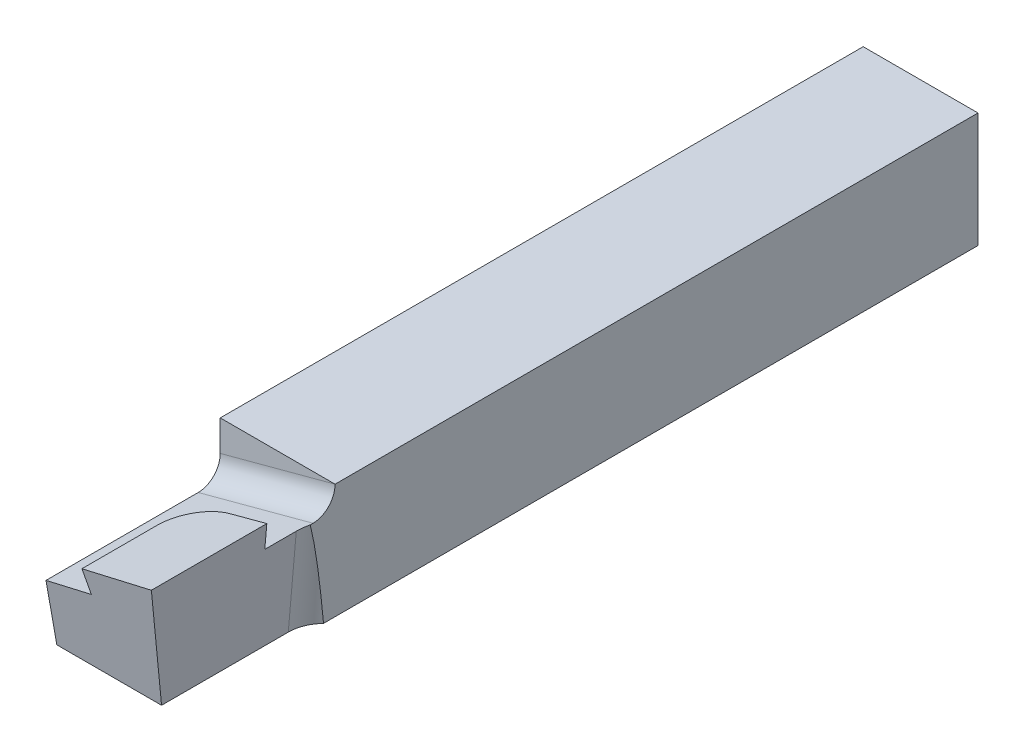
ISO-10303-21;
HEADER;
FILE_DESCRIPTION(('STEP AP214'),'2;1');
FILE_NAME('part.step','',(''),(''),'','','');
FILE_SCHEMA(('AUTOMOTIVE_DESIGN { 1 0 10303 214 1 1 1 1 }'));
ENDSEC;
DATA;
#1=APPLICATION_CONTEXT('core data for automotive mechanical design processes');
#2=APPLICATION_PROTOCOL_DEFINITION('international standard','automotive_design',2000,#1);
#3=PRODUCT_CONTEXT('',#1,'mechanical');
#4=PRODUCT('Part','Part','',(#3));
#5=PRODUCT_RELATED_PRODUCT_CATEGORY('part','',(#4));
#6=PRODUCT_DEFINITION_FORMATION('','',#4);
#7=PRODUCT_DEFINITION_CONTEXT('part definition',#1,'design');
#8=PRODUCT_DEFINITION('design','',#6,#7);
#9=PRODUCT_DEFINITION_SHAPE('','',#8);
#10=(LENGTH_UNIT() NAMED_UNIT(*) SI_UNIT(.MILLI.,.METRE.));
#11=(NAMED_UNIT(*) PLANE_ANGLE_UNIT() SI_UNIT($,.RADIAN.));
#12=(NAMED_UNIT(*) SI_UNIT($,.STERADIAN.) SOLID_ANGLE_UNIT());
#13=UNCERTAINTY_MEASURE_WITH_UNIT(LENGTH_MEASURE(1.E-05),#10,'distance_accuracy_value','');
#14=(GEOMETRIC_REPRESENTATION_CONTEXT(3) GLOBAL_UNCERTAINTY_ASSIGNED_CONTEXT((#13)) GLOBAL_UNIT_ASSIGNED_CONTEXT((#10,
#11,#12)) REPRESENTATION_CONTEXT('',''));
#15=CARTESIAN_POINT('',(0.,0.,0.));
#16=DIRECTION('',(0.,0.,1.));
#17=DIRECTION('',(1.,0.,0.));
#18=AXIS2_PLACEMENT_3D('',#15,#16,#17);
#19=CARTESIAN_POINT('',(3.96875,-3.96875,57.15));
#20=DIRECTION('',(-1.,0.,0.));
#21=DIRECTION('',(0.,0.,1.));
#22=AXIS2_PLACEMENT_3D('',#19,#20,#21);
#23=PLANE('',#22);
#24=DIRECTION('',(0.,0.,-1.));
#25=VECTOR('',#24,1.);
#26=CARTESIAN_POINT('',(3.96875,3.96875,57.15));
#27=LINE('',#26,#25);
#28=CARTESIAN_POINT('',(3.96875,3.96875,44.45));
#29=VERTEX_POINT('',#28);
#30=CARTESIAN_POINT('',(3.96875,3.96875,0.));
#31=VERTEX_POINT('',#30);
#32=EDGE_CURVE('E202',#29,#31,#27,.T.);
#33=ORIENTED_EDGE('',*,*,#32,.F.);
#34=CARTESIAN_POINT('',(3.96875,3.96875,45.974));
#35=DIRECTION('',(-1.,0.,0.));
#36=DIRECTION('',(0.,-1.,0.));
#37=AXIS2_PLACEMENT_3D('',#34,#35,#36);
#38=ELLIPSE('',#37,1.57776089894496,1.524);
#39=CARTESIAN_POINT('',(3.96875,2.39098910105504,45.974));
#40=VERTEX_POINT('',#39);
#41=EDGE_CURVE('E45',#29,#40,#38,.T.);
#42=ORIENTED_EDGE('',*,*,#41,.T.);
#43=DIRECTION('',(0.,0.,-1.));
#44=VECTOR('',#43,1.);
#45=CARTESIAN_POINT('',(3.96875,2.39098910105504,57.15));
#46=LINE('',#45,#44);
#47=CARTESIAN_POINT('',(3.96875,2.39098910105504,46.1655934043086));
#48=VERTEX_POINT('',#47);
#49=EDGE_CURVE('E164',#48,#40,#46,.T.);
#50=ORIENTED_EDGE('',*,*,#49,.F.);
#51=CARTESIAN_POINT('',(3.96875,-25.1744816440037,46.99));
#52=DIRECTION('',(-1.,0.,0.));
#53=DIRECTION('',(0.,-1.,0.));
#54=AXIS2_PLACEMENT_3D('',#51,#52,#53);
#55=ELLIPSE('',#54,29.1432316440037,2.54);
#56=CARTESIAN_POINT('',(3.96875,-3.96875,45.2476590504527));
#57=VERTEX_POINT('',#56);
#58=EDGE_CURVE('E207',#48,#57,#55,.T.);
#59=ORIENTED_EDGE('',*,*,#58,.T.);
#60=DIRECTION('',(0.,0.,-1.));
#61=VECTOR('',#60,1.);
#62=CARTESIAN_POINT('',(3.96875,-3.96875,57.15));
#63=LINE('',#62,#61);
#64=CARTESIAN_POINT('',(3.96875,-3.96875,0.));
#65=VERTEX_POINT('',#64);
#66=EDGE_CURVE('E196',#57,#65,#63,.T.);
#67=ORIENTED_EDGE('',*,*,#66,.T.);
#68=DIRECTION('',(0.,1.,0.));
#69=VECTOR('',#68,1.);
#70=CARTESIAN_POINT('',(3.96875,-3.96875,0.));
#71=LINE('',#70,#69);
#72=EDGE_CURVE('E184',#65,#31,#71,.T.);
#73=ORIENTED_EDGE('',*,*,#72,.T.);
#74=EDGE_LOOP('',(#33,#42,#50,#59,#67,#73));
#75=FACE_BOUND('',#74,.T.);
#76=ADVANCED_FACE('F37',(#75),#23,.F.);
#77=CARTESIAN_POINT('',(-3.96875,-3.96875,57.15));
#78=DIRECTION('',(1.,0.,0.));
#79=DIRECTION('',(0.,0.,-1.));
#80=AXIS2_PLACEMENT_3D('',#77,#78,#79);
#81=PLANE('',#80);
#82=DIRECTION('',(0.,0.,1.));
#83=VECTOR('',#82,1.);
#84=CARTESIAN_POINT('',(-3.96875,0.264142386133057,57.15));
#85=LINE('',#84,#83);
#86=CARTESIAN_POINT('',(-3.96875,0.264142386133057,45.974));
#87=VERTEX_POINT('',#86);
#88=CARTESIAN_POINT('',(-3.96875,0.264142386133057,56.4967777247373));
#89=VERTEX_POINT('',#88);
#90=EDGE_CURVE('E153',#87,#89,#85,.T.);
#91=ORIENTED_EDGE('',*,*,#90,.F.);
#92=CARTESIAN_POINT('',(-3.96875,1.84190328507802,45.974));
#93=DIRECTION('',(1.,0.,0.));
#94=DIRECTION('',(0.,-1.,0.));
#95=AXIS2_PLACEMENT_3D('',#92,#93,#94);
#96=ELLIPSE('',#95,1.57776089894496,1.524);
#97=CARTESIAN_POINT('',(-3.96875,1.84190328507802,44.45));
#98=VERTEX_POINT('',#97);
#99=EDGE_CURVE('E12',#87,#98,#96,.T.);
#100=ORIENTED_EDGE('',*,*,#99,.T.);
#101=DIRECTION('',(0.,-1.,0.));
#102=VECTOR('',#101,1.);
#103=CARTESIAN_POINT('',(-3.96875,-3.96875,44.45));
#104=LINE('',#103,#102);
#105=CARTESIAN_POINT('',(-3.96875,3.96875,44.45));
#106=VERTEX_POINT('',#105);
#107=EDGE_CURVE('E181',#106,#98,#104,.T.);
#108=ORIENTED_EDGE('',*,*,#107,.F.);
#109=DIRECTION('',(0.,0.,-1.));
#110=VECTOR('',#109,1.);
#111=CARTESIAN_POINT('',(-3.96875,3.96875,57.15));
#112=LINE('',#111,#110);
#113=CARTESIAN_POINT('',(-3.96875,3.96875,0.));
#114=VERTEX_POINT('',#113);
#115=EDGE_CURVE('E200',#106,#114,#112,.T.);
#116=ORIENTED_EDGE('',*,*,#115,.T.);
#117=DIRECTION('',(0.,-1.,0.));
#118=VECTOR('',#117,1.);
#119=CARTESIAN_POINT('',(-3.96875,-3.96875,0.));
#120=LINE('',#119,#118);
#121=CARTESIAN_POINT('',(-3.96875,-3.96875,0.));
#122=VERTEX_POINT('',#121);
#123=EDGE_CURVE('E190',#114,#122,#120,.T.);
#124=ORIENTED_EDGE('',*,*,#123,.T.);
#125=DIRECTION('',(0.,0.,-1.));
#126=VECTOR('',#125,1.);
#127=CARTESIAN_POINT('',(-3.96875,-3.96875,57.15));
#128=LINE('',#127,#126);
#129=CARTESIAN_POINT('',(-3.96875,-3.96875,55.7504045906266));
#130=VERTEX_POINT('',#129);
#131=EDGE_CURVE('E198',#130,#122,#128,.T.);
#132=ORIENTED_EDGE('',*,*,#131,.F.);
#133=DIRECTION('',(0.,0.984807753012209,0.173648177666925));
#134=VECTOR('',#133,1.);
#135=CARTESIAN_POINT('',(-3.96875,3.96875,57.15));
#136=LINE('',#135,#134);
#137=EDGE_CURVE('E166',#130,#89,#136,.T.);
#138=ORIENTED_EDGE('',*,*,#137,.T.);
#139=EDGE_LOOP('',(#91,#100,#108,#116,#124,#132,#138));
#140=FACE_BOUND('',#139,.T.);
#141=ADVANCED_FACE('F242',(#140),#81,.F.);
#142=CARTESIAN_POINT('',(-3.96875,1.84190328507802,44.45));
#143=DIRECTION('',(-0.258819045102515,0.96592582628907,0.));
#144=DIRECTION('',(-0.96592582628907,-0.258819045102515,0.));
#145=AXIS2_PLACEMENT_3D('',#142,#143,#144);
#146=PLANE('',#145);
#147=DIRECTION('',(0.,0.,1.));
#148=VECTOR('',#147,1.);
#149=CARTESIAN_POINT('',(3.96875,3.96875,44.45));
#150=LINE('',#149,#148);
#151=CARTESIAN_POINT('',(3.96875,3.96875,49.1667074892632));
#152=VERTEX_POINT('',#151);
#153=CARTESIAN_POINT('',(3.96875,3.96875,57.15));
#154=VERTEX_POINT('',#153);
#155=EDGE_CURVE('E175',#152,#154,#150,.T.);
#156=ORIENTED_EDGE('',*,*,#155,.F.);
#157=DIRECTION('',(-0.96592582628907,-0.258819045102515,0.));
#158=VECTOR('',#157,1.);
#159=CARTESIAN_POINT('',(-0.726331660634737,2.71070666063478,49.1667074892632));
#160=LINE('',#159,#158);
#161=CARTESIAN_POINT('',(1.38207648375664,3.27565292023964,49.1667074892632));
#162=VERTEX_POINT('',#161);
#163=EDGE_CURVE('E137',#152,#162,#160,.T.);
#164=ORIENTED_EDGE('',*,*,#163,.T.);
#165=CARTESIAN_POINT('',(1.38207648375664,3.27565292023964,51.7067074892632));
#166=DIRECTION('',(-0.258819045102515,0.96592582628907,0.));
#167=DIRECTION('',(-0.96592582628907,-0.258819045102515,0.));
#168=AXIS2_PLACEMENT_3D('',#165,#166,#167);
#169=CIRCLE('',#168,2.54);
#170=CARTESIAN_POINT('',(-1.0713751150176,2.61825254567925,51.7067074892632));
#171=VERTEX_POINT('',#170);
#172=EDGE_CURVE('E282',#162,#171,#169,.T.);
#173=ORIENTED_EDGE('',*,*,#172,.T.);
#174=DIRECTION('',(0.,0.,-1.));
#175=VECTOR('',#174,1.);
#176=CARTESIAN_POINT('',(-1.0713751150176,2.61825254567925,0.));
#177=LINE('',#176,#175);
#178=CARTESIAN_POINT('',(-1.07137511501769,2.61825254567923,56.9118708614252));
#179=VERTEX_POINT('',#178);
#180=EDGE_CURVE('E150',#179,#171,#177,.T.);
#181=ORIENTED_EDGE('',*,*,#180,.F.);
#182=DIRECTION('',(-0.964921520309633,-0.258549942126371,-0.0455893306574897));
#183=VECTOR('',#182,1.);
#184=CARTESIAN_POINT('',(-4.51092740598211,1.69662728699072,56.749363462216));
#185=LINE('',#184,#183);
#186=EDGE_CURVE('E171',#154,#179,#185,.T.);
#187=ORIENTED_EDGE('',*,*,#186,.F.);
#188=EDGE_LOOP('',(#156,#164,#173,#181,#187));
#189=FACE_BOUND('',#188,.T.);
#190=ADVANCED_FACE('F254',(#189),#146,.T.);
#191=CARTESIAN_POINT('',(3.96875,3.96875,44.45));
#192=DIRECTION('',(0.996194698091746,-0.0871557427476514,0.));
#193=DIRECTION('',(0.0871557427476514,0.996194698091746,0.));
#194=AXIS2_PLACEMENT_3D('',#191,#192,#193);
#195=PLANE('',#194);
#196=DIRECTION('',(0.,0.,1.));
#197=VECTOR('',#196,1.);
#198=CARTESIAN_POINT('',(3.82740021283627,2.35311453973421,44.45));
#199=LINE('',#198,#197);
#200=CARTESIAN_POINT('',(3.82740021283627,2.35311453973421,46.99));
#201=VERTEX_POINT('',#200);
#202=CARTESIAN_POINT('',(3.82740021283627,2.35311453973421,49.1667074892632));
#203=VERTEX_POINT('',#202);
#204=EDGE_CURVE('E161',#201,#203,#199,.T.);
#205=ORIENTED_EDGE('',*,*,#204,.T.);
#206=DIRECTION('',(0.0871557427476514,0.996194698091746,0.));
#207=VECTOR('',#206,1.);
#208=CARTESIAN_POINT('',(3.96875,3.96875,49.1667074892632));
#209=LINE('',#208,#207);
#210=EDGE_CURVE('E217',#203,#152,#209,.T.);
#211=ORIENTED_EDGE('',*,*,#210,.T.);
#212=ORIENTED_EDGE('',*,*,#155,.T.);
#213=DIRECTION('',(0.0858414827856193,0.981172637986293,0.173007208809877));
#214=VECTOR('',#213,1.);
#215=CARTESIAN_POINT('',(3.78013981922212,1.81292576887537,56.7698700223877));
#216=LINE('',#215,#214);
#217=CARTESIAN_POINT('',(3.27430873326303,-3.96875,55.7504045906266));
#218=VERTEX_POINT('',#217);
#219=EDGE_CURVE('E211',#218,#154,#216,.T.);
#220=ORIENTED_EDGE('',*,*,#219,.F.);
#221=DIRECTION('',(0.,0.,1.));
#222=VECTOR('',#221,1.);
#223=CARTESIAN_POINT('',(3.27430873326303,-3.96875,44.45));
#224=LINE('',#223,#222);
#225=CARTESIAN_POINT('',(3.27430873326303,-3.96875,46.99));
#226=VERTEX_POINT('',#225);
#227=EDGE_CURVE('E174',#226,#218,#224,.T.);
#228=ORIENTED_EDGE('',*,*,#227,.F.);
#229=DIRECTION('',(0.0871557427476514,0.996194698091746,0.));
#230=VECTOR('',#229,1.);
#231=CARTESIAN_POINT('',(3.96875,3.96875,46.99));
#232=LINE('',#231,#230);
#233=EDGE_CURVE('E204',#226,#201,#232,.T.);
#234=ORIENTED_EDGE('',*,*,#233,.T.);
#235=EDGE_LOOP('',(#205,#211,#212,#220,#228,#234));
#236=FACE_BOUND('',#235,.T.);
#237=ADVANCED_FACE('F259',(#236),#195,.T.);
#238=CARTESIAN_POINT('',(6.49908453315304,3.74737441342097,46.99));
#239=DIRECTION('',(-0.0871557427476514,-0.996194698091746,0.));
#240=DIRECTION('',(0.996194698091746,-0.0871557427476514,0.));
#241=AXIS2_PLACEMENT_3D('',#238,#239,#240);
#242=CYLINDRICAL_SURFACE('',#241,2.54);
#243=CARTESIAN_POINT('',(6.43830887009729,3.05270540595871,46.99));
#244=DIRECTION('',(-0.258819045102515,0.96592582628907,0.));
#245=DIRECTION('',(-0.96592582628907,-0.258819045102515,0.));
#246=AXIS2_PLACEMENT_3D('',#243,#244,#245);
#247=ELLIPSE('',#246,2.7030115420888,2.54);
#248=EDGE_CURVE('E159',#201,#48,#247,.F.);
#249=ORIENTED_EDGE('',*,*,#248,.F.);
#250=ORIENTED_EDGE('',*,*,#233,.F.);
#251=CARTESIAN_POINT('',(5.82401112062313,-3.96875,46.99));
#252=DIRECTION('',(0.,1.,0.));
#253=DIRECTION('',(-1.,0.,0.));
#254=AXIS2_PLACEMENT_3D('',#251,#252,#253);
#255=ELLIPSE('',#254,2.5497023873601,2.54);
#256=EDGE_CURVE('E209',#57,#226,#255,.T.);
#257=ORIENTED_EDGE('',*,*,#256,.F.);
#258=ORIENTED_EDGE('',*,*,#58,.F.);
#259=EDGE_LOOP('',(#249,#250,#257,#258));
#260=FACE_BOUND('',#259,.T.);
#261=ADVANCED_FACE('F257',(#260),#242,.F.);
#262=CARTESIAN_POINT('',(-3.96875,3.96875,57.15));
#263=DIRECTION('',(0.,-1.,0.));
#264=DIRECTION('',(0.,0.,-1.));
#265=AXIS2_PLACEMENT_3D('',#262,#263,#264);
#266=PLANE('',#265);
#267=DIRECTION('',(-1.,0.,0.));
#268=VECTOR('',#267,1.);
#269=CARTESIAN_POINT('',(-3.96875,3.96875,44.45));
#270=LINE('',#269,#268);
#271=EDGE_CURVE('E177',#29,#106,#270,.T.);
#272=ORIENTED_EDGE('',*,*,#271,.F.);
#273=ORIENTED_EDGE('',*,*,#32,.T.);
#274=DIRECTION('',(-1.,0.,0.));
#275=VECTOR('',#274,1.);
#276=CARTESIAN_POINT('',(-3.96875,3.96875,0.));
#277=LINE('',#276,#275);
#278=EDGE_CURVE('E187',#31,#114,#277,.T.);
#279=ORIENTED_EDGE('',*,*,#278,.T.);
#280=ORIENTED_EDGE('',*,*,#115,.F.);
#281=EDGE_LOOP('',(#272,#273,#279,#280));
#282=FACE_BOUND('',#281,.T.);
#283=ADVANCED_FACE('F232',(#282),#266,.F.);
#284=CARTESIAN_POINT('',(-3.96875,-3.96875,57.15));
#285=DIRECTION('',(0.,1.,0.));
#286=DIRECTION('',(0.,0.,1.));
#287=AXIS2_PLACEMENT_3D('',#284,#285,#286);
#288=PLANE('',#287);
#289=ORIENTED_EDGE('',*,*,#227,.T.);
#290=DIRECTION('',(1.,0.,0.));
#291=VECTOR('',#290,1.);
#292=CARTESIAN_POINT('',(-3.96875,-3.96875,55.7504045906266));
#293=LINE('',#292,#291);
#294=EDGE_CURVE('E169',#130,#218,#293,.T.);
#295=ORIENTED_EDGE('',*,*,#294,.F.);
#296=ORIENTED_EDGE('',*,*,#131,.T.);
#297=DIRECTION('',(1.,0.,0.));
#298=VECTOR('',#297,1.);
#299=CARTESIAN_POINT('',(-3.96875,-3.96875,0.));
#300=LINE('',#299,#298);
#301=EDGE_CURVE('E193',#122,#65,#300,.T.);
#302=ORIENTED_EDGE('',*,*,#301,.T.);
#303=ORIENTED_EDGE('',*,*,#66,.F.);
#304=ORIENTED_EDGE('',*,*,#256,.T.);
#305=EDGE_LOOP('',(#289,#295,#296,#302,#303,#304));
#306=FACE_BOUND('',#305,.T.);
#307=ADVANCED_FACE('F265',(#306),#288,.F.);
#308=CARTESIAN_POINT('',(0.,0.,0.));
#309=DIRECTION('',(0.,0.,-1.));
#310=DIRECTION('',(-1.,0.,0.));
#311=AXIS2_PLACEMENT_3D('',#308,#309,#310);
#312=PLANE('',#311);
#313=ORIENTED_EDGE('',*,*,#72,.F.);
#314=ORIENTED_EDGE('',*,*,#301,.F.);
#315=ORIENTED_EDGE('',*,*,#123,.F.);
#316=ORIENTED_EDGE('',*,*,#278,.F.);
#317=EDGE_LOOP('',(#313,#314,#315,#316));
#318=FACE_BOUND('',#317,.T.);
#319=ADVANCED_FACE('F238',(#318),#312,.T.);
#320=CARTESIAN_POINT('',(0.,0.,44.45));
#321=DIRECTION('',(0.,0.,1.));
#322=DIRECTION('',(1.,0.,0.));
#323=AXIS2_PLACEMENT_3D('',#320,#321,#322);
#324=PLANE('',#323);
#325=ORIENTED_EDGE('',*,*,#107,.T.);
#326=DIRECTION('',(0.96592582628907,0.258819045102515,0.));
#327=VECTOR('',#326,1.);
#328=CARTESIAN_POINT('',(3.57430977526377,3.86306006031958,44.45));
#329=LINE('',#328,#327);
#330=EDGE_CURVE('E220',#98,#29,#329,.T.);
#331=ORIENTED_EDGE('',*,*,#330,.T.);
#332=ORIENTED_EDGE('',*,*,#271,.T.);
#333=EDGE_LOOP('',(#325,#331,#332));
#334=FACE_BOUND('',#333,.T.);
#335=ADVANCED_FACE('F226',(#334),#324,.T.);
#336=CARTESIAN_POINT('',(-3.96875,3.96875,57.15));
#337=DIRECTION('',(0.,0.173648177666925,-0.984807753012209));
#338=DIRECTION('',(0.,0.984807753012209,0.173648177666925));
#339=AXIS2_PLACEMENT_3D('',#336,#337,#338);
#340=PLANE('',#339);
#341=ORIENTED_EDGE('',*,*,#186,.T.);
#342=DIRECTION('',(0.255144817820937,-0.952213423395665,-0.167900917937423));
#343=VECTOR('',#342,1.);
#344=CARTESIAN_POINT('',(-1.59829868548993,4.58475808238762,57.2586188452594));
#345=LINE('',#344,#343);
#346=CARTESIAN_POINT('',(-0.67693489028137,1.14618158641471,56.6523050337894));
#347=VERTEX_POINT('',#346);
#348=EDGE_CURVE('E215',#179,#347,#345,.T.);
#349=ORIENTED_EDGE('',*,*,#348,.T.);
#350=DIRECTION('',(0.964921520309633,0.258549942126371,0.0455893306574897));
#351=VECTOR('',#350,1.);
#352=CARTESIAN_POINT('',(-3.01578766831736,0.519487873324695,56.5418020235313));
#353=LINE('',#352,#351);
#354=EDGE_CURVE('E133',#89,#347,#353,.T.);
#355=ORIENTED_EDGE('',*,*,#354,.F.);
#356=ORIENTED_EDGE('',*,*,#137,.F.);
#357=ORIENTED_EDGE('',*,*,#294,.T.);
#358=ORIENTED_EDGE('',*,*,#219,.T.);
#359=EDGE_LOOP('',(#341,#349,#355,#356,#357,#358));
#360=FACE_BOUND('',#359,.T.);
#361=ADVANCED_FACE('F277',(#360),#340,.F.);
#362=CARTESIAN_POINT('',(-0.67693489028137,1.14618158641471,0.));
#363=DIRECTION('',(0.96592582628907,0.258819045102515,0.));
#364=DIRECTION('',(-0.258819045102515,0.96592582628907,0.));
#365=AXIS2_PLACEMENT_3D('',#362,#363,#364);
#366=PLANE('',#365);
#367=ORIENTED_EDGE('',*,*,#180,.T.);
#368=DIRECTION('',(-0.258819045102515,0.96592582628907,0.));
#369=VECTOR('',#368,1.);
#370=CARTESIAN_POINT('',(-0.676934890281369,1.14618158641471,51.7067074892632));
#371=LINE('',#370,#369);
#372=CARTESIAN_POINT('',(-0.676934890281369,1.14618158641471,51.7067074892632));
#373=VERTEX_POINT('',#372);
#374=EDGE_CURVE('E143',#373,#171,#371,.T.);
#375=ORIENTED_EDGE('',*,*,#374,.F.);
#376=DIRECTION('',(0.,0.,-1.));
#377=VECTOR('',#376,1.);
#378=CARTESIAN_POINT('',(-0.67693489028137,1.14618158641471,0.));
#379=LINE('',#378,#377);
#380=EDGE_CURVE('E127',#347,#373,#379,.T.);
#381=ORIENTED_EDGE('',*,*,#380,.F.);
#382=ORIENTED_EDGE('',*,*,#348,.F.);
#383=EDGE_LOOP('',(#367,#375,#381,#382));
#384=FACE_BOUND('',#383,.T.);
#385=ADVANCED_FACE('F148',(#384),#366,.F.);
#386=CARTESIAN_POINT('',(-0.331891435898505,1.23863570137024,0.));
#387=DIRECTION('',(-0.258819045102515,0.96592582628907,0.));
#388=DIRECTION('',(-0.96592582628907,-0.258819045102515,0.));
#389=AXIS2_PLACEMENT_3D('',#386,#387,#388);
#390=PLANE('',#389);
#391=ORIENTED_EDGE('',*,*,#49,.T.);
#392=DIRECTION('',(0.96592582628907,0.258819045102515,0.));
#393=VECTOR('',#392,1.);
#394=CARTESIAN_POINT('',(-3.96875,0.264142386133057,45.974));
#395=LINE('',#394,#393);
#396=EDGE_CURVE('E52',#40,#87,#395,.F.);
#397=ORIENTED_EDGE('',*,*,#396,.T.);
#398=ORIENTED_EDGE('',*,*,#90,.T.);
#399=ORIENTED_EDGE('',*,*,#354,.T.);
#400=ORIENTED_EDGE('',*,*,#380,.T.);
#401=CARTESIAN_POINT('',(1.77651670849287,1.8035819609751,51.7067074892632));
#402=DIRECTION('',(-0.258819045102515,0.96592582628907,0.));
#403=DIRECTION('',(-0.96592582628907,-0.258819045102515,0.));
#404=AXIS2_PLACEMENT_3D('',#401,#402,#403);
#405=CIRCLE('',#404,2.54);
#406=CARTESIAN_POINT('',(1.77651670849287,1.8035819609751,49.1667074892632));
#407=VERTEX_POINT('',#406);
#408=EDGE_CURVE('E131',#407,#373,#405,.T.);
#409=ORIENTED_EDGE('',*,*,#408,.F.);
#410=DIRECTION('',(-0.96592582628907,-0.258819045102515,0.));
#411=VECTOR('',#410,1.);
#412=CARTESIAN_POINT('',(-0.331891435898505,1.23863570137024,49.1667074892632));
#413=LINE('',#412,#411);
#414=EDGE_CURVE('E146',#203,#407,#413,.T.);
#415=ORIENTED_EDGE('',*,*,#414,.F.);
#416=ORIENTED_EDGE('',*,*,#204,.F.);
#417=ORIENTED_EDGE('',*,*,#248,.T.);
#418=EDGE_LOOP('',(#391,#397,#398,#399,#400,#409,#415,#416,#417));
#419=FACE_BOUND('',#418,.T.);
#420=ADVANCED_FACE('F129',(#419),#390,.T.);
#421=CARTESIAN_POINT('',(-0.331891435898505,1.23863570137024,49.1667074892632));
#422=DIRECTION('',(0.,0.,-1.));
#423=DIRECTION('',(-1.,0.,0.));
#424=AXIS2_PLACEMENT_3D('',#421,#422,#423);
#425=PLANE('',#424);
#426=ORIENTED_EDGE('',*,*,#414,.T.);
#427=DIRECTION('',(-0.258819045102515,0.96592582628907,0.));
#428=VECTOR('',#427,1.);
#429=CARTESIAN_POINT('',(1.77651670849287,1.8035819609751,49.1667074892632));
#430=LINE('',#429,#428);
#431=EDGE_CURVE('E145',#407,#162,#430,.T.);
#432=ORIENTED_EDGE('',*,*,#431,.T.);
#433=ORIENTED_EDGE('',*,*,#163,.F.);
#434=ORIENTED_EDGE('',*,*,#210,.F.);
#435=EDGE_LOOP('',(#426,#432,#433,#434));
#436=FACE_BOUND('',#435,.T.);
#437=ADVANCED_FACE('F247',(#436),#425,.T.);
#438=CARTESIAN_POINT('',(1.77651670849287,1.8035819609751,51.7067074892632));
#439=DIRECTION('',(-0.258819045102515,0.96592582628907,0.));
#440=DIRECTION('',(-0.96592582628907,-0.258819045102515,0.));
#441=AXIS2_PLACEMENT_3D('',#438,#439,#440);
#442=CYLINDRICAL_SURFACE('',#441,2.54);
#443=ORIENTED_EDGE('',*,*,#172,.F.);
#444=ORIENTED_EDGE('',*,*,#431,.F.);
#445=ORIENTED_EDGE('',*,*,#408,.T.);
#446=ORIENTED_EDGE('',*,*,#374,.T.);
#447=EDGE_LOOP('',(#443,#444,#445,#446));
#448=FACE_BOUND('',#447,.T.);
#449=ADVANCED_FACE('F142',(#448),#442,.T.);
#450=CARTESIAN_POINT('',(-0.726331660634737,2.71070666063478,45.974));
#451=DIRECTION('',(-0.96592582628907,-0.258819045102515,0.));
#452=DIRECTION('',(0.258819045102515,-0.96592582628907,0.));
#453=AXIS2_PLACEMENT_3D('',#450,#451,#452);
#454=CYLINDRICAL_SURFACE('',#453,1.524);
#455=ORIENTED_EDGE('',*,*,#99,.F.);
#456=ORIENTED_EDGE('',*,*,#396,.F.);
#457=ORIENTED_EDGE('',*,*,#41,.F.);
#458=ORIENTED_EDGE('',*,*,#330,.F.);
#459=EDGE_LOOP('',(#455,#456,#457,#458));
#460=FACE_BOUND('',#459,.T.);
#461=ADVANCED_FACE('F39',(#460),#454,.F.);
#462=CLOSED_SHELL('',(#76,#141,#190,#237,#261,#283,#307,#319,#335,#361,#385,#420,#437,#449,#461));
#463=MANIFOLD_SOLID_BREP('B2',#462);
#464=ADVANCED_BREP_SHAPE_REPRESENTATION('',(#18,#463),#14);
#465=SHAPE_DEFINITION_REPRESENTATION(#9,#464);
ENDSEC;
END-ISO-10303-21;
